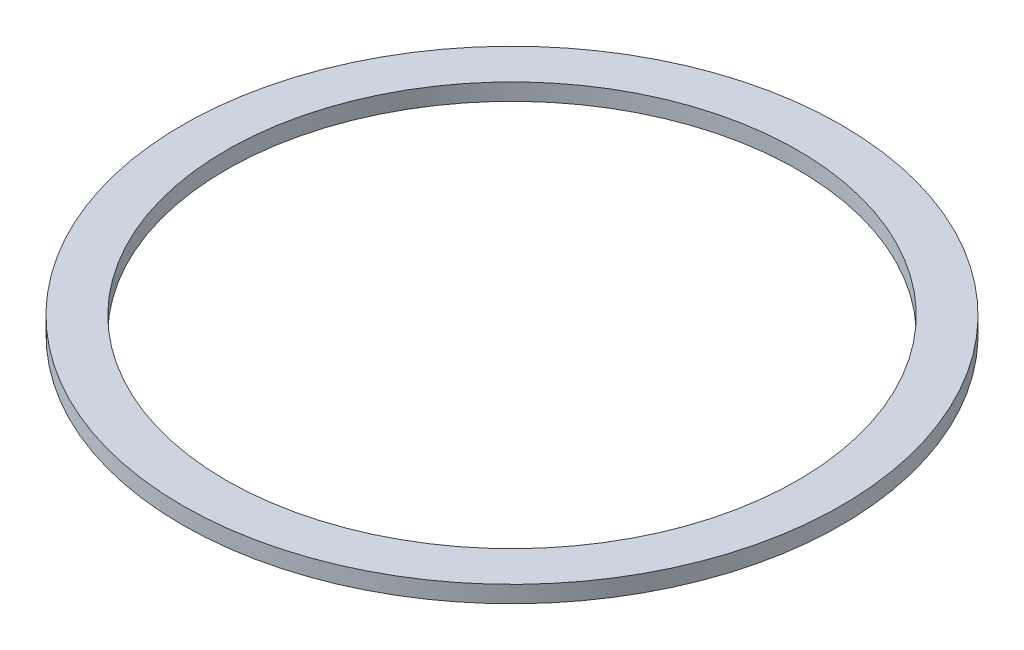
ISO-10303-21;
HEADER;
FILE_DESCRIPTION(('STEP AP214'),'2;1');
FILE_NAME('part.step','',(''),(''),'','','');
FILE_SCHEMA(('AUTOMOTIVE_DESIGN { 1 0 10303 214 1 1 1 1 }'));
ENDSEC;
DATA;
#1=APPLICATION_CONTEXT('core data for automotive mechanical design processes');
#2=APPLICATION_PROTOCOL_DEFINITION('international standard','automotive_design',2000,#1);
#3=PRODUCT_CONTEXT('',#1,'mechanical');
#4=PRODUCT('Part','Part','',(#3));
#5=PRODUCT_RELATED_PRODUCT_CATEGORY('part','',(#4));
#6=PRODUCT_DEFINITION_FORMATION('','',#4);
#7=PRODUCT_DEFINITION_CONTEXT('part definition',#1,'design');
#8=PRODUCT_DEFINITION('design','',#6,#7);
#9=PRODUCT_DEFINITION_SHAPE('','',#8);
#10=(LENGTH_UNIT() NAMED_UNIT(*) SI_UNIT(.MILLI.,.METRE.));
#11=(NAMED_UNIT(*) PLANE_ANGLE_UNIT() SI_UNIT($,.RADIAN.));
#12=(NAMED_UNIT(*) SI_UNIT($,.STERADIAN.) SOLID_ANGLE_UNIT());
#13=UNCERTAINTY_MEASURE_WITH_UNIT(LENGTH_MEASURE(1.E-05),#10,'distance_accuracy_value','');
#14=(GEOMETRIC_REPRESENTATION_CONTEXT(3) GLOBAL_UNCERTAINTY_ASSIGNED_CONTEXT((#13)) GLOBAL_UNIT_ASSIGNED_CONTEXT((#10,
#11,#12)) REPRESENTATION_CONTEXT('',''));
#15=CARTESIAN_POINT('',(0.,0.,0.));
#16=DIRECTION('',(0.,0.,1.));
#17=DIRECTION('',(1.,0.,0.));
#18=AXIS2_PLACEMENT_3D('',#15,#16,#17);
#19=CARTESIAN_POINT('',(0.,10.,0.));
#20=DIRECTION('',(0.,1.,0.));
#21=DIRECTION('',(0.,0.,1.));
#22=AXIS2_PLACEMENT_3D('',#19,#20,#21);
#23=PLANE('',#22);
#24=CARTESIAN_POINT('',(0.,10.,0.));
#25=DIRECTION('',(0.,1.,0.));
#26=DIRECTION('',(0.,0.,1.));
#27=AXIS2_PLACEMENT_3D('',#24,#25,#26);
#28=CIRCLE('',#27,196.);
#29=CARTESIAN_POINT('',(0.,10.,196.));
#30=VERTEX_POINT('',#29);
#31=EDGE_CURVE('E10',#30,#30,#28,.T.);
#32=ORIENTED_EDGE('',*,*,#31,.T.);
#33=EDGE_LOOP('',(#32));
#34=FACE_BOUND('',#33,.T.);
#35=CARTESIAN_POINT('',(0.,10.,0.));
#36=DIRECTION('',(0.,1.,0.));
#37=DIRECTION('',(0.,0.,1.));
#38=AXIS2_PLACEMENT_3D('',#35,#36,#37);
#39=CIRCLE('',#38,170.);
#40=CARTESIAN_POINT('',(0.,10.,170.));
#41=VERTEX_POINT('',#40);
#42=EDGE_CURVE('E50',#41,#41,#39,.T.);
#43=ORIENTED_EDGE('',*,*,#42,.F.);
#44=EDGE_LOOP('',(#43));
#45=FACE_BOUND('',#44,.T.);
#46=ADVANCED_FACE('F37',(#34,#45),#23,.T.);
#47=CARTESIAN_POINT('',(0.,0.,0.));
#48=DIRECTION('',(0.,1.,0.));
#49=DIRECTION('',(0.,0.,1.));
#50=AXIS2_PLACEMENT_3D('',#47,#48,#49);
#51=PLANE('',#50);
#52=CARTESIAN_POINT('',(0.,0.,0.));
#53=DIRECTION('',(0.,1.,0.));
#54=DIRECTION('',(0.,0.,1.));
#55=AXIS2_PLACEMENT_3D('',#52,#53,#54);
#56=CIRCLE('',#55,196.);
#57=CARTESIAN_POINT('',(0.,0.,196.));
#58=VERTEX_POINT('',#57);
#59=EDGE_CURVE('E41',#58,#58,#56,.T.);
#60=ORIENTED_EDGE('',*,*,#59,.F.);
#61=EDGE_LOOP('',(#60));
#62=FACE_BOUND('',#61,.T.);
#63=CARTESIAN_POINT('',(0.,0.,0.));
#64=DIRECTION('',(0.,1.,0.));
#65=DIRECTION('',(0.,0.,1.));
#66=AXIS2_PLACEMENT_3D('',#63,#64,#65);
#67=CIRCLE('',#66,170.);
#68=CARTESIAN_POINT('',(0.,0.,170.));
#69=VERTEX_POINT('',#68);
#70=EDGE_CURVE('E52',#69,#69,#67,.T.);
#71=ORIENTED_EDGE('',*,*,#70,.T.);
#72=EDGE_LOOP('',(#71));
#73=FACE_BOUND('',#72,.T.);
#74=ADVANCED_FACE('F64',(#62,#73),#51,.F.);
#75=CARTESIAN_POINT('',(0.,10.,0.));
#76=DIRECTION('',(0.,-1.,0.));
#77=DIRECTION('',(0.,0.,-1.));
#78=AXIS2_PLACEMENT_3D('',#75,#76,#77);
#79=CYLINDRICAL_SURFACE('',#78,196.);
#80=ORIENTED_EDGE('',*,*,#31,.F.);
#81=EDGE_LOOP('',(#80));
#82=FACE_BOUND('',#81,.T.);
#83=ORIENTED_EDGE('',*,*,#59,.T.);
#84=EDGE_LOOP('',(#83));
#85=FACE_BOUND('',#84,.T.);
#86=ADVANCED_FACE('F39',(#82,#85),#79,.T.);
#87=CARTESIAN_POINT('',(0.,10.,0.));
#88=DIRECTION('',(0.,-1.,0.));
#89=DIRECTION('',(0.,0.,-1.));
#90=AXIS2_PLACEMENT_3D('',#87,#88,#89);
#91=CYLINDRICAL_SURFACE('',#90,170.);
#92=ORIENTED_EDGE('',*,*,#42,.T.);
#93=EDGE_LOOP('',(#92));
#94=FACE_BOUND('',#93,.T.);
#95=ORIENTED_EDGE('',*,*,#70,.F.);
#96=EDGE_LOOP('',(#95));
#97=FACE_BOUND('',#96,.T.);
#98=ADVANCED_FACE('F60',(#94,#97),#91,.F.);
#99=CLOSED_SHELL('',(#46,#74,#86,#98));
#100=MANIFOLD_SOLID_BREP('B2',#99);
#101=ADVANCED_BREP_SHAPE_REPRESENTATION('',(#18,#100),#14);
#102=SHAPE_DEFINITION_REPRESENTATION(#9,#101);
ENDSEC;
END-ISO-10303-21;
